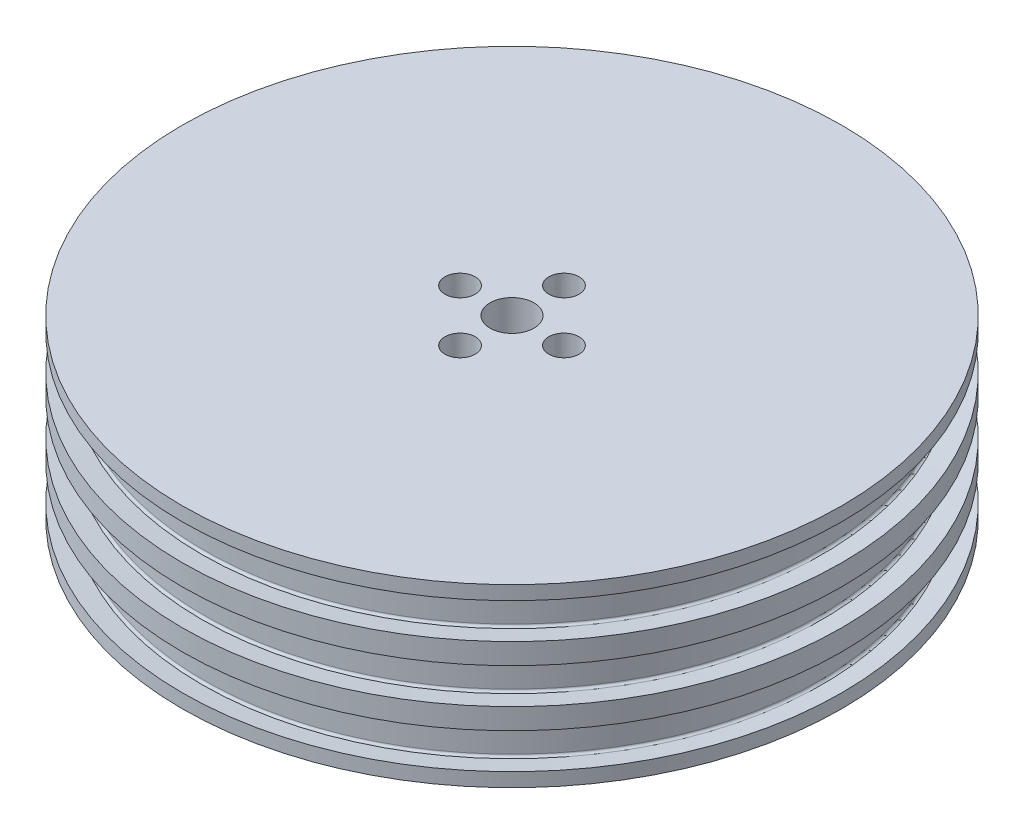
ISO-10303-21;
HEADER;
FILE_DESCRIPTION(('STEP AP214'),'2;1');
FILE_NAME('part.step','',(''),(''),'','','');
FILE_SCHEMA(('AUTOMOTIVE_DESIGN { 1 0 10303 214 1 1 1 1 }'));
ENDSEC;
DATA;
#1=APPLICATION_CONTEXT('core data for automotive mechanical design processes');
#2=APPLICATION_PROTOCOL_DEFINITION('international standard','automotive_design',2000,#1);
#3=PRODUCT_CONTEXT('',#1,'mechanical');
#4=PRODUCT('Part','Part','',(#3));
#5=PRODUCT_RELATED_PRODUCT_CATEGORY('part','',(#4));
#6=PRODUCT_DEFINITION_FORMATION('','',#4);
#7=PRODUCT_DEFINITION_CONTEXT('part definition',#1,'design');
#8=PRODUCT_DEFINITION('design','',#6,#7);
#9=PRODUCT_DEFINITION_SHAPE('','',#8);
#10=(LENGTH_UNIT() NAMED_UNIT(*) SI_UNIT(.MILLI.,.METRE.));
#11=(NAMED_UNIT(*) PLANE_ANGLE_UNIT() SI_UNIT($,.RADIAN.));
#12=(NAMED_UNIT(*) SI_UNIT($,.STERADIAN.) SOLID_ANGLE_UNIT());
#13=UNCERTAINTY_MEASURE_WITH_UNIT(LENGTH_MEASURE(1.E-05),#10,'distance_accuracy_value','');
#14=(GEOMETRIC_REPRESENTATION_CONTEXT(3) GLOBAL_UNCERTAINTY_ASSIGNED_CONTEXT((#13)) GLOBAL_UNIT_ASSIGNED_CONTEXT((#10,
#11,#12)) REPRESENTATION_CONTEXT('',''));
#15=CARTESIAN_POINT('',(0.,0.,0.));
#16=DIRECTION('',(0.,0.,1.));
#17=DIRECTION('',(1.,0.,0.));
#18=AXIS2_PLACEMENT_3D('',#15,#16,#17);
#19=CARTESIAN_POINT('',(0.,20.32,0.));
#20=DIRECTION('',(0.,-1.,0.));
#21=DIRECTION('',(0.,0.,-1.));
#22=AXIS2_PLACEMENT_3D('',#19,#20,#21);
#23=CYLINDRICAL_SURFACE('',#22,2.54);
#24=CARTESIAN_POINT('',(0.,20.32,0.));
#25=DIRECTION('',(0.,-1.,0.));
#26=DIRECTION('',(0.,0.,-1.));
#27=AXIS2_PLACEMENT_3D('',#24,#25,#26);
#28=CIRCLE('',#27,2.54);
#29=CARTESIAN_POINT('',(0.,20.32,-2.54));
#30=VERTEX_POINT('',#29);
#31=EDGE_CURVE('E132',#30,#30,#28,.T.);
#32=ORIENTED_EDGE('',*,*,#31,.F.);
#33=EDGE_LOOP('',(#32));
#34=FACE_BOUND('',#33,.T.);
#35=CARTESIAN_POINT('',(0.,15.24,0.));
#36=DIRECTION('',(0.,-1.,0.));
#37=DIRECTION('',(0.,0.,-1.));
#38=AXIS2_PLACEMENT_3D('',#35,#36,#37);
#39=CIRCLE('',#38,2.54);
#40=CARTESIAN_POINT('',(0.,15.24,-2.54));
#41=VERTEX_POINT('',#40);
#42=EDGE_CURVE('E111',#41,#41,#39,.F.);
#43=ORIENTED_EDGE('',*,*,#42,.F.);
#44=EDGE_LOOP('',(#43));
#45=FACE_BOUND('',#44,.T.);
#46=ADVANCED_FACE('F32',(#34,#45),#23,.F.);
#47=CARTESIAN_POINT('',(-6.,22.86,0.));
#48=DIRECTION('',(0.,-1.,0.));
#49=DIRECTION('',(0.,0.,-1.));
#50=AXIS2_PLACEMENT_3D('',#47,#48,#49);
#51=CYLINDRICAL_SURFACE('',#50,1.75);
#52=CARTESIAN_POINT('',(-6.,20.32,0.));
#53=DIRECTION('',(0.,1.,0.));
#54=DIRECTION('',(0.,0.,1.));
#55=AXIS2_PLACEMENT_3D('',#52,#53,#54);
#56=CIRCLE('',#55,1.75);
#57=CARTESIAN_POINT('',(-6.,20.32,1.75));
#58=VERTEX_POINT('',#57);
#59=EDGE_CURVE('E116',#58,#58,#56,.T.);
#60=ORIENTED_EDGE('',*,*,#59,.T.);
#61=EDGE_LOOP('',(#60));
#62=FACE_BOUND('',#61,.T.);
#63=CARTESIAN_POINT('',(-6.,15.24,0.));
#64=DIRECTION('',(0.,-1.,0.));
#65=DIRECTION('',(0.,0.,-1.));
#66=AXIS2_PLACEMENT_3D('',#63,#64,#65);
#67=CIRCLE('',#66,1.75);
#68=CARTESIAN_POINT('',(-6.,15.24,-1.75));
#69=VERTEX_POINT('',#68);
#70=EDGE_CURVE('E105',#69,#69,#67,.T.);
#71=ORIENTED_EDGE('',*,*,#70,.T.);
#72=EDGE_LOOP('',(#71));
#73=FACE_BOUND('',#72,.T.);
#74=ADVANCED_FACE('F235',(#62,#73),#51,.F.);
#75=CARTESIAN_POINT('',(0.,22.86,-6.));
#76=DIRECTION('',(0.,-1.,0.));
#77=DIRECTION('',(0.,0.,-1.));
#78=AXIS2_PLACEMENT_3D('',#75,#76,#77);
#79=CYLINDRICAL_SURFACE('',#78,1.75);
#80=CARTESIAN_POINT('',(0.,20.32,-6.));
#81=DIRECTION('',(0.,1.,0.));
#82=DIRECTION('',(0.,0.,1.));
#83=AXIS2_PLACEMENT_3D('',#80,#81,#82);
#84=CIRCLE('',#83,1.75);
#85=CARTESIAN_POINT('',(0.,20.32,-4.25));
#86=VERTEX_POINT('',#85);
#87=EDGE_CURVE('E119',#86,#86,#84,.T.);
#88=ORIENTED_EDGE('',*,*,#87,.T.);
#89=EDGE_LOOP('',(#88));
#90=FACE_BOUND('',#89,.T.);
#91=CARTESIAN_POINT('',(0.,15.24,-6.));
#92=DIRECTION('',(0.,-1.,0.));
#93=DIRECTION('',(0.,0.,-1.));
#94=AXIS2_PLACEMENT_3D('',#91,#92,#93);
#95=CIRCLE('',#94,1.75);
#96=CARTESIAN_POINT('',(0.,15.24,-7.75));
#97=VERTEX_POINT('',#96);
#98=EDGE_CURVE('E301',#97,#97,#95,.T.);
#99=ORIENTED_EDGE('',*,*,#98,.T.);
#100=EDGE_LOOP('',(#99));
#101=FACE_BOUND('',#100,.T.);
#102=ADVANCED_FACE('F241',(#90,#101),#79,.F.);
#103=CARTESIAN_POINT('',(6.,22.86,0.));
#104=DIRECTION('',(0.,-1.,0.));
#105=DIRECTION('',(0.,0.,-1.));
#106=AXIS2_PLACEMENT_3D('',#103,#104,#105);
#107=CYLINDRICAL_SURFACE('',#106,1.75);
#108=CARTESIAN_POINT('',(6.,20.32,0.));
#109=DIRECTION('',(0.,1.,0.));
#110=DIRECTION('',(0.,0.,1.));
#111=AXIS2_PLACEMENT_3D('',#108,#109,#110);
#112=CIRCLE('',#111,1.75);
#113=CARTESIAN_POINT('',(6.,20.32,1.75));
#114=VERTEX_POINT('',#113);
#115=EDGE_CURVE('E122',#114,#114,#112,.T.);
#116=ORIENTED_EDGE('',*,*,#115,.T.);
#117=EDGE_LOOP('',(#116));
#118=FACE_BOUND('',#117,.T.);
#119=CARTESIAN_POINT('',(6.,15.24,0.));
#120=DIRECTION('',(0.,-1.,0.));
#121=DIRECTION('',(0.,0.,-1.));
#122=AXIS2_PLACEMENT_3D('',#119,#120,#121);
#123=CIRCLE('',#122,1.75);
#124=CARTESIAN_POINT('',(6.,15.24,-1.75));
#125=VERTEX_POINT('',#124);
#126=EDGE_CURVE('E303',#125,#125,#123,.T.);
#127=ORIENTED_EDGE('',*,*,#126,.T.);
#128=EDGE_LOOP('',(#127));
#129=FACE_BOUND('',#128,.T.);
#130=ADVANCED_FACE('F322',(#118,#129),#107,.F.);
#131=CARTESIAN_POINT('',(0.,22.86,6.));
#132=DIRECTION('',(0.,-1.,0.));
#133=DIRECTION('',(0.,0.,-1.));
#134=AXIS2_PLACEMENT_3D('',#131,#132,#133);
#135=CYLINDRICAL_SURFACE('',#134,1.75);
#136=CARTESIAN_POINT('',(0.,20.32,6.));
#137=DIRECTION('',(0.,1.,0.));
#138=DIRECTION('',(0.,0.,1.));
#139=AXIS2_PLACEMENT_3D('',#136,#137,#138);
#140=CIRCLE('',#139,1.75);
#141=CARTESIAN_POINT('',(0.,20.32,7.75));
#142=VERTEX_POINT('',#141);
#143=EDGE_CURVE('E125',#142,#142,#140,.T.);
#144=ORIENTED_EDGE('',*,*,#143,.T.);
#145=EDGE_LOOP('',(#144));
#146=FACE_BOUND('',#145,.T.);
#147=CARTESIAN_POINT('',(0.,15.24,6.));
#148=DIRECTION('',(0.,-1.,0.));
#149=DIRECTION('',(0.,0.,-1.));
#150=AXIS2_PLACEMENT_3D('',#147,#148,#149);
#151=CIRCLE('',#150,1.75);
#152=CARTESIAN_POINT('',(0.,15.24,4.25));
#153=VERTEX_POINT('',#152);
#154=EDGE_CURVE('E308',#153,#153,#151,.T.);
#155=ORIENTED_EDGE('',*,*,#154,.T.);
#156=EDGE_LOOP('',(#155));
#157=FACE_BOUND('',#156,.T.);
#158=ADVANCED_FACE('F282',(#146,#157),#135,.F.);
#159=CARTESIAN_POINT('',(0.,20.32,0.));
#160=DIRECTION('',(0.,-1.,0.));
#161=DIRECTION('',(0.,0.,-1.));
#162=AXIS2_PLACEMENT_3D('',#159,#160,#161);
#163=CYLINDRICAL_SURFACE('',#162,38.1);
#164=CARTESIAN_POINT('',(0.,20.32,0.));
#165=DIRECTION('',(0.,1.,0.));
#166=DIRECTION('',(0.,0.,1.));
#167=AXIS2_PLACEMENT_3D('',#164,#165,#166);
#168=CIRCLE('',#167,38.1);
#169=CARTESIAN_POINT('',(0.,20.32,38.1));
#170=VERTEX_POINT('',#169);
#171=EDGE_CURVE('E138',#170,#170,#168,.T.);
#172=ORIENTED_EDGE('',*,*,#171,.F.);
#173=EDGE_LOOP('',(#172));
#174=FACE_BOUND('',#173,.T.);
#175=CARTESIAN_POINT('',(0.,18.715602656128,0.));
#176=DIRECTION('',(0.,-1.,0.));
#177=DIRECTION('',(0.,0.,-1.));
#178=AXIS2_PLACEMENT_3D('',#175,#176,#177);
#179=CIRCLE('',#178,38.1);
#180=CARTESIAN_POINT('',(0.,18.715602656128,-38.1));
#181=VERTEX_POINT('',#180);
#182=EDGE_CURVE('E157',#181,#181,#179,.T.);
#183=ORIENTED_EDGE('',*,*,#182,.F.);
#184=EDGE_LOOP('',(#183));
#185=FACE_BOUND('',#184,.T.);
#186=ADVANCED_FACE('F230',(#174,#185),#163,.T.);
#187=CARTESIAN_POINT('',(0.,20.32,0.));
#188=DIRECTION('',(0.,1.,0.));
#189=DIRECTION('',(0.,0.,1.));
#190=AXIS2_PLACEMENT_3D('',#187,#188,#189);
#191=PLANE('',#190);
#192=ORIENTED_EDGE('',*,*,#143,.F.);
#193=EDGE_LOOP('',(#192));
#194=FACE_BOUND('',#193,.T.);
#195=ORIENTED_EDGE('',*,*,#115,.F.);
#196=EDGE_LOOP('',(#195));
#197=FACE_BOUND('',#196,.T.);
#198=ORIENTED_EDGE('',*,*,#87,.F.);
#199=EDGE_LOOP('',(#198));
#200=FACE_BOUND('',#199,.T.);
#201=ORIENTED_EDGE('',*,*,#59,.F.);
#202=EDGE_LOOP('',(#201));
#203=FACE_BOUND('',#202,.T.);
#204=ORIENTED_EDGE('',*,*,#31,.T.);
#205=EDGE_LOOP('',(#204));
#206=FACE_BOUND('',#205,.T.);
#207=ORIENTED_EDGE('',*,*,#171,.T.);
#208=EDGE_LOOP('',(#207));
#209=FACE_BOUND('',#208,.T.);
#210=ADVANCED_FACE('F260',(#194,#197,#200,#203,#206,#209),#191,.T.);
#211=CARTESIAN_POINT('',(0.,14.9562946877439,0.));
#212=DIRECTION('',(0.,1.,0.));
#213=DIRECTION('',(0.,0.,1.));
#214=AXIS2_PLACEMENT_3D('',#211,#212,#213);
#215=CONICAL_SURFACE('',#214,40.64,1.43989663289533);
#216=CARTESIAN_POINT('',(0.,14.3253044955856,0.));
#217=DIRECTION('',(0.,1.,0.));
#218=DIRECTION('',(0.,0.,1.));
#219=AXIS2_PLACEMENT_3D('',#216,#217,#218);
#220=CIRCLE('',#219,35.8471536528239);
#221=CARTESIAN_POINT('',(0.,14.3253044955856,35.8471536528239));
#222=VERTEX_POINT('',#221);
#223=EDGE_CURVE('E170',#222,#222,#220,.F.);
#224=ORIENTED_EDGE('',*,*,#223,.T.);
#225=EDGE_LOOP('',(#224));
#226=FACE_BOUND('',#225,.T.);
#227=CARTESIAN_POINT('',(0.,14.621897343872,0.));
#228=DIRECTION('',(0.,1.,0.));
#229=DIRECTION('',(0.,0.,1.));
#230=AXIS2_PLACEMENT_3D('',#227,#228,#229);
#231=CIRCLE('',#230,38.1);
#232=CARTESIAN_POINT('',(0.,14.621897343872,38.1));
#233=VERTEX_POINT('',#232);
#234=EDGE_CURVE('E145',#233,#233,#231,.T.);
#235=ORIENTED_EDGE('',*,*,#234,.T.);
#236=EDGE_LOOP('',(#235));
#237=FACE_BOUND('',#236,.T.);
#238=ADVANCED_FACE('F253',(#226,#237),#215,.F.);
#239=CARTESIAN_POINT('',(0.,19.05,0.));
#240=DIRECTION('',(0.,-1.,0.));
#241=DIRECTION('',(0.,0.,-1.));
#242=AXIS2_PLACEMENT_3D('',#239,#240,#241);
#243=CONICAL_SURFACE('',#242,35.56,1.43989663289533);
#244=CARTESIAN_POINT('',(0.,19.0121955044144,0.));
#245=DIRECTION('',(0.,-1.,0.));
#246=DIRECTION('',(0.,0.,-1.));
#247=AXIS2_PLACEMENT_3D('',#244,#245,#246);
#248=CIRCLE('',#247,35.8471536528239);
#249=CARTESIAN_POINT('',(0.,19.0121955044144,-35.8471536528239));
#250=VERTEX_POINT('',#249);
#251=EDGE_CURVE('E167',#250,#250,#248,.F.);
#252=ORIENTED_EDGE('',*,*,#251,.T.);
#253=EDGE_LOOP('',(#252));
#254=FACE_BOUND('',#253,.T.);
#255=ORIENTED_EDGE('',*,*,#182,.T.);
#256=EDGE_LOOP('',(#255));
#257=FACE_BOUND('',#256,.T.);
#258=ADVANCED_FACE('F250',(#254,#257),#243,.F.);
#259=CARTESIAN_POINT('',(0.,0.,0.));
#260=DIRECTION('',(0.,-1.,0.));
#261=DIRECTION('',(0.,0.,-1.));
#262=AXIS2_PLACEMENT_3D('',#259,#260,#261);
#263=CYLINDRICAL_SURFACE('',#262,35.56);
#264=CARTESIAN_POINT('',(0.,18.7603685096254,0.));
#265=DIRECTION('',(0.,-1.,0.));
#266=DIRECTION('',(0.,0.,-1.));
#267=AXIS2_PLACEMENT_3D('',#264,#265,#266);
#268=CIRCLE('',#267,35.56);
#269=CARTESIAN_POINT('',(0.,18.7603685096254,-35.56));
#270=VERTEX_POINT('',#269);
#271=EDGE_CURVE('E164',#270,#270,#268,.T.);
#272=ORIENTED_EDGE('',*,*,#271,.T.);
#273=EDGE_LOOP('',(#272));
#274=FACE_BOUND('',#273,.T.);
#275=CARTESIAN_POINT('',(0.,14.5771314903746,0.));
#276=DIRECTION('',(0.,-1.,0.));
#277=DIRECTION('',(0.,0.,-1.));
#278=AXIS2_PLACEMENT_3D('',#275,#276,#277);
#279=CIRCLE('',#278,35.56);
#280=CARTESIAN_POINT('',(0.,14.5771314903746,-35.56));
#281=VERTEX_POINT('',#280);
#282=EDGE_CURVE('E141',#281,#281,#279,.F.);
#283=ORIENTED_EDGE('',*,*,#282,.T.);
#284=EDGE_LOOP('',(#283));
#285=FACE_BOUND('',#284,.T.);
#286=ADVANCED_FACE('F228',(#274,#285),#263,.T.);
#287=CARTESIAN_POINT('',(0.,12.206852656128,0.));
#288=DIRECTION('',(0.,-1.,0.));
#289=DIRECTION('',(0.,0.,-1.));
#290=AXIS2_PLACEMENT_3D('',#287,#288,#289);
#291=CIRCLE('',#290,38.1);
#292=CARTESIAN_POINT('',(0.,12.206852656128,-38.1));
#293=VERTEX_POINT('',#292);
#294=EDGE_CURVE('E151',#293,#293,#291,.T.);
#295=ORIENTED_EDGE('',*,*,#294,.F.);
#296=EDGE_LOOP('',(#295));
#297=FACE_BOUND('',#296,.T.);
#298=ORIENTED_EDGE('',*,*,#234,.F.);
#299=EDGE_LOOP('',(#298));
#300=FACE_BOUND('',#299,.T.);
#301=ADVANCED_FACE('F216',(#297,#300),#163,.T.);
#302=CARTESIAN_POINT('',(0.,8.44754468774393,0.));
#303=DIRECTION('',(0.,1.,0.));
#304=DIRECTION('',(0.,0.,1.));
#305=AXIS2_PLACEMENT_3D('',#302,#303,#304);
#306=CONICAL_SURFACE('',#305,40.6399999999999,1.43989663289533);
#307=CARTESIAN_POINT('',(0.,7.81655449558555,0.));
#308=DIRECTION('',(0.,1.,0.));
#309=DIRECTION('',(0.,0.,1.));
#310=AXIS2_PLACEMENT_3D('',#307,#308,#309);
#311=CIRCLE('',#310,35.8471536528238);
#312=CARTESIAN_POINT('',(0.,7.81655449558555,35.8471536528238));
#313=VERTEX_POINT('',#312);
#314=EDGE_CURVE('E182',#313,#313,#311,.F.);
#315=ORIENTED_EDGE('',*,*,#314,.T.);
#316=EDGE_LOOP('',(#315));
#317=FACE_BOUND('',#316,.T.);
#318=CARTESIAN_POINT('',(0.,8.11314734387198,0.));
#319=DIRECTION('',(0.,1.,0.));
#320=DIRECTION('',(0.,0.,1.));
#321=AXIS2_PLACEMENT_3D('',#318,#319,#320);
#322=CIRCLE('',#321,38.1);
#323=CARTESIAN_POINT('',(0.,8.11314734387198,38.1));
#324=VERTEX_POINT('',#323);
#325=EDGE_CURVE('E154',#324,#324,#322,.T.);
#326=ORIENTED_EDGE('',*,*,#325,.T.);
#327=EDGE_LOOP('',(#326));
#328=FACE_BOUND('',#327,.T.);
#329=ADVANCED_FACE('F227',(#317,#328),#306,.F.);
#330=CARTESIAN_POINT('',(0.,12.54125,0.));
#331=DIRECTION('',(0.,-1.,0.));
#332=DIRECTION('',(0.,0.,-1.));
#333=AXIS2_PLACEMENT_3D('',#330,#331,#332);
#334=CONICAL_SURFACE('',#333,35.5599999999999,1.43989663289533);
#335=CARTESIAN_POINT('',(0.,12.5034455044144,0.));
#336=DIRECTION('',(0.,-1.,0.));
#337=DIRECTION('',(0.,0.,-1.));
#338=AXIS2_PLACEMENT_3D('',#335,#336,#337);
#339=CIRCLE('',#338,35.8471536528238);
#340=CARTESIAN_POINT('',(0.,12.5034455044144,-35.8471536528238));
#341=VERTEX_POINT('',#340);
#342=EDGE_CURVE('E179',#341,#341,#339,.F.);
#343=ORIENTED_EDGE('',*,*,#342,.T.);
#344=EDGE_LOOP('',(#343));
#345=FACE_BOUND('',#344,.T.);
#346=ORIENTED_EDGE('',*,*,#294,.T.);
#347=EDGE_LOOP('',(#346));
#348=FACE_BOUND('',#347,.T.);
#349=ADVANCED_FACE('F262',(#345,#348),#334,.F.);
#350=CARTESIAN_POINT('',(0.,0.,0.));
#351=DIRECTION('',(0.,-1.,0.));
#352=DIRECTION('',(0.,0.,-1.));
#353=AXIS2_PLACEMENT_3D('',#350,#351,#352);
#354=CYLINDRICAL_SURFACE('',#353,35.5599999999999);
#355=CARTESIAN_POINT('',(0.,12.2516185096254,0.));
#356=DIRECTION('',(0.,-1.,0.));
#357=DIRECTION('',(0.,0.,-1.));
#358=AXIS2_PLACEMENT_3D('',#355,#356,#357);
#359=CIRCLE('',#358,35.5599999999999);
#360=CARTESIAN_POINT('',(0.,12.2516185096254,-35.5599999999999));
#361=VERTEX_POINT('',#360);
#362=EDGE_CURVE('E176',#361,#361,#359,.T.);
#363=ORIENTED_EDGE('',*,*,#362,.T.);
#364=EDGE_LOOP('',(#363));
#365=FACE_BOUND('',#364,.T.);
#366=CARTESIAN_POINT('',(0.,8.06838149037455,0.));
#367=DIRECTION('',(0.,-1.,0.));
#368=DIRECTION('',(0.,0.,-1.));
#369=AXIS2_PLACEMENT_3D('',#366,#367,#368);
#370=CIRCLE('',#369,35.5599999999999);
#371=CARTESIAN_POINT('',(0.,8.06838149037455,-35.5599999999999));
#372=VERTEX_POINT('',#371);
#373=EDGE_CURVE('E173',#372,#372,#370,.F.);
#374=ORIENTED_EDGE('',*,*,#373,.T.);
#375=EDGE_LOOP('',(#374));
#376=FACE_BOUND('',#375,.T.);
#377=ADVANCED_FACE('F232',(#365,#376),#354,.T.);
#378=CARTESIAN_POINT('',(0.,5.69810265612802,0.));
#379=DIRECTION('',(0.,-1.,0.));
#380=DIRECTION('',(0.,0.,-1.));
#381=AXIS2_PLACEMENT_3D('',#378,#379,#380);
#382=CIRCLE('',#381,38.1);
#383=CARTESIAN_POINT('',(0.,5.69810265612802,-38.1));
#384=VERTEX_POINT('',#383);
#385=EDGE_CURVE('E137',#384,#384,#382,.T.);
#386=ORIENTED_EDGE('',*,*,#385,.F.);
#387=EDGE_LOOP('',(#386));
#388=FACE_BOUND('',#387,.T.);
#389=ORIENTED_EDGE('',*,*,#325,.F.);
#390=EDGE_LOOP('',(#389));
#391=FACE_BOUND('',#390,.T.);
#392=ADVANCED_FACE('F206',(#388,#391),#163,.T.);
#393=CARTESIAN_POINT('',(0.,1.93879468774394,0.));
#394=DIRECTION('',(0.,1.,0.));
#395=DIRECTION('',(0.,0.,1.));
#396=AXIS2_PLACEMENT_3D('',#393,#394,#395);
#397=CONICAL_SURFACE('',#396,40.6399999999999,1.43989663289533);
#398=CARTESIAN_POINT('',(0.,1.3078044955856,0.));
#399=DIRECTION('',(0.,1.,0.));
#400=DIRECTION('',(0.,0.,1.));
#401=AXIS2_PLACEMENT_3D('',#398,#399,#400);
#402=CIRCLE('',#401,35.8471536528238);
#403=CARTESIAN_POINT('',(0.,1.3078044955856,35.8471536528238));
#404=VERTEX_POINT('',#403);
#405=EDGE_CURVE('E185',#404,#404,#402,.F.);
#406=ORIENTED_EDGE('',*,*,#405,.T.);
#407=EDGE_LOOP('',(#406));
#408=FACE_BOUND('',#407,.T.);
#409=CARTESIAN_POINT('',(0.,1.60439734387199,0.));
#410=DIRECTION('',(0.,1.,0.));
#411=DIRECTION('',(0.,0.,1.));
#412=AXIS2_PLACEMENT_3D('',#409,#410,#411);
#413=CIRCLE('',#412,38.1);
#414=CARTESIAN_POINT('',(0.,1.60439734387199,38.1));
#415=VERTEX_POINT('',#414);
#416=EDGE_CURVE('E148',#415,#415,#413,.T.);
#417=ORIENTED_EDGE('',*,*,#416,.T.);
#418=EDGE_LOOP('',(#417));
#419=FACE_BOUND('',#418,.T.);
#420=ADVANCED_FACE('F202',(#408,#419),#397,.F.);
#421=CARTESIAN_POINT('',(0.,6.0325,0.));
#422=DIRECTION('',(0.,-1.,0.));
#423=DIRECTION('',(0.,0.,-1.));
#424=AXIS2_PLACEMENT_3D('',#421,#422,#423);
#425=CONICAL_SURFACE('',#424,35.5599999999999,1.43989663289533);
#426=CARTESIAN_POINT('',(0.,5.99469550441439,0.));
#427=DIRECTION('',(0.,-1.,0.));
#428=DIRECTION('',(0.,0.,-1.));
#429=AXIS2_PLACEMENT_3D('',#426,#427,#428);
#430=CIRCLE('',#429,35.8471536528237);
#431=CARTESIAN_POINT('',(0.,5.99469550441439,-35.8471536528237));
#432=VERTEX_POINT('',#431);
#433=EDGE_CURVE('E11',#432,#432,#430,.F.);
#434=ORIENTED_EDGE('',*,*,#433,.T.);
#435=EDGE_LOOP('',(#434));
#436=FACE_BOUND('',#435,.T.);
#437=ORIENTED_EDGE('',*,*,#385,.T.);
#438=EDGE_LOOP('',(#437));
#439=FACE_BOUND('',#438,.T.);
#440=ADVANCED_FACE('F205',(#436,#439),#425,.F.);
#441=CARTESIAN_POINT('',(0.,0.,0.));
#442=DIRECTION('',(0.,-1.,0.));
#443=DIRECTION('',(0.,0.,-1.));
#444=AXIS2_PLACEMENT_3D('',#441,#442,#443);
#445=CYLINDRICAL_SURFACE('',#444,35.5599999999999);
#446=CARTESIAN_POINT('',(0.,1.55963149037456,0.));
#447=DIRECTION('',(0.,-1.,0.));
#448=DIRECTION('',(0.,0.,-1.));
#449=AXIS2_PLACEMENT_3D('',#446,#447,#448);
#450=CIRCLE('',#449,35.5599999999999);
#451=CARTESIAN_POINT('',(0.,1.55963149037456,-35.5599999999999));
#452=VERTEX_POINT('',#451);
#453=EDGE_CURVE('E40',#452,#452,#450,.F.);
#454=ORIENTED_EDGE('',*,*,#453,.T.);
#455=EDGE_LOOP('',(#454));
#456=FACE_BOUND('',#455,.T.);
#457=CARTESIAN_POINT('',(0.,5.74286850962545,0.));
#458=DIRECTION('',(0.,-1.,0.));
#459=DIRECTION('',(0.,0.,-1.));
#460=AXIS2_PLACEMENT_3D('',#457,#458,#459);
#461=CIRCLE('',#460,35.5599999999999);
#462=CARTESIAN_POINT('',(0.,5.74286850962545,-35.5599999999999));
#463=VERTEX_POINT('',#462);
#464=EDGE_CURVE('E188',#463,#463,#461,.T.);
#465=ORIENTED_EDGE('',*,*,#464,.T.);
#466=EDGE_LOOP('',(#465));
#467=FACE_BOUND('',#466,.T.);
#468=ADVANCED_FACE('F193',(#456,#467),#445,.T.);
#469=CARTESIAN_POINT('',(0.,0.,0.));
#470=DIRECTION('',(0.,1.,0.));
#471=DIRECTION('',(0.,0.,1.));
#472=AXIS2_PLACEMENT_3D('',#469,#470,#471);
#473=PLANE('',#472);
#474=CARTESIAN_POINT('',(0.,0.,0.));
#475=DIRECTION('',(0.,-1.,0.));
#476=DIRECTION('',(0.,0.,-1.));
#477=AXIS2_PLACEMENT_3D('',#474,#475,#476);
#478=CIRCLE('',#477,12.7);
#479=CARTESIAN_POINT('',(0.,0.,-12.7));
#480=VERTEX_POINT('',#479);
#481=EDGE_CURVE('E128',#480,#480,#478,.T.);
#482=ORIENTED_EDGE('',*,*,#481,.F.);
#483=EDGE_LOOP('',(#482));
#484=FACE_BOUND('',#483,.T.);
#485=CARTESIAN_POINT('',(0.,0.,0.));
#486=DIRECTION('',(0.,1.,0.));
#487=DIRECTION('',(0.,0.,1.));
#488=AXIS2_PLACEMENT_3D('',#485,#486,#487);
#489=CIRCLE('',#488,38.1);
#490=CARTESIAN_POINT('',(0.,0.,38.1));
#491=VERTEX_POINT('',#490);
#492=EDGE_CURVE('E142',#491,#491,#489,.T.);
#493=ORIENTED_EDGE('',*,*,#492,.F.);
#494=EDGE_LOOP('',(#493));
#495=FACE_BOUND('',#494,.T.);
#496=ADVANCED_FACE('F213',(#484,#495),#473,.F.);
#497=ORIENTED_EDGE('',*,*,#492,.T.);
#498=EDGE_LOOP('',(#497));
#499=FACE_BOUND('',#498,.T.);
#500=ORIENTED_EDGE('',*,*,#416,.F.);
#501=EDGE_LOOP('',(#500));
#502=FACE_BOUND('',#501,.T.);
#503=ADVANCED_FACE('F210',(#499,#502),#163,.T.);
#504=CARTESIAN_POINT('',(0.,18.7603685096254,0.));
#505=DIRECTION('',(0.,-1.,0.));
#506=DIRECTION('',(0.,0.,-1.));
#507=AXIS2_PLACEMENT_3D('',#504,#505,#506);
#508=TOROIDAL_SURFACE('',#507,35.814,0.254);
#509=ORIENTED_EDGE('',*,*,#251,.F.);
#510=EDGE_LOOP('',(#509));
#511=FACE_BOUND('',#510,.T.);
#512=ORIENTED_EDGE('',*,*,#271,.F.);
#513=EDGE_LOOP('',(#512));
#514=FACE_BOUND('',#513,.T.);
#515=ADVANCED_FACE('F212',(#511,#514),#508,.F.);
#516=CARTESIAN_POINT('',(0.,14.5771314903746,0.));
#517=DIRECTION('',(0.,-1.,0.));
#518=DIRECTION('',(0.,0.,-1.));
#519=AXIS2_PLACEMENT_3D('',#516,#517,#518);
#520=TOROIDAL_SURFACE('',#519,35.814,0.254);
#521=ORIENTED_EDGE('',*,*,#282,.F.);
#522=EDGE_LOOP('',(#521));
#523=FACE_BOUND('',#522,.T.);
#524=ORIENTED_EDGE('',*,*,#223,.F.);
#525=EDGE_LOOP('',(#524));
#526=FACE_BOUND('',#525,.T.);
#527=ADVANCED_FACE('F221',(#523,#526),#520,.F.);
#528=CARTESIAN_POINT('',(0.,12.2516185096254,0.));
#529=DIRECTION('',(0.,-1.,0.));
#530=DIRECTION('',(0.,0.,-1.));
#531=AXIS2_PLACEMENT_3D('',#528,#529,#530);
#532=TOROIDAL_SURFACE('',#531,35.8139999999999,0.254);
#533=ORIENTED_EDGE('',*,*,#342,.F.);
#534=EDGE_LOOP('',(#533));
#535=FACE_BOUND('',#534,.T.);
#536=ORIENTED_EDGE('',*,*,#362,.F.);
#537=EDGE_LOOP('',(#536));
#538=FACE_BOUND('',#537,.T.);
#539=ADVANCED_FACE('F454',(#535,#538),#532,.F.);
#540=CARTESIAN_POINT('',(0.,8.06838149037455,0.));
#541=DIRECTION('',(0.,-1.,0.));
#542=DIRECTION('',(0.,0.,-1.));
#543=AXIS2_PLACEMENT_3D('',#540,#541,#542);
#544=TOROIDAL_SURFACE('',#543,35.8139999999999,0.254);
#545=ORIENTED_EDGE('',*,*,#373,.F.);
#546=EDGE_LOOP('',(#545));
#547=FACE_BOUND('',#546,.T.);
#548=ORIENTED_EDGE('',*,*,#314,.F.);
#549=EDGE_LOOP('',(#548));
#550=FACE_BOUND('',#549,.T.);
#551=ADVANCED_FACE('F199',(#547,#550),#544,.F.);
#552=CARTESIAN_POINT('',(0.,1.55963149037456,0.));
#553=DIRECTION('',(0.,-1.,0.));
#554=DIRECTION('',(0.,0.,-1.));
#555=AXIS2_PLACEMENT_3D('',#552,#553,#554);
#556=TOROIDAL_SURFACE('',#555,35.8139999999999,0.254);
#557=ORIENTED_EDGE('',*,*,#453,.F.);
#558=EDGE_LOOP('',(#557));
#559=FACE_BOUND('',#558,.T.);
#560=ORIENTED_EDGE('',*,*,#405,.F.);
#561=EDGE_LOOP('',(#560));
#562=FACE_BOUND('',#561,.T.);
#563=ADVANCED_FACE('F196',(#559,#562),#556,.F.);
#564=CARTESIAN_POINT('',(0.,5.74286850962545,0.));
#565=DIRECTION('',(0.,-1.,0.));
#566=DIRECTION('',(0.,0.,-1.));
#567=AXIS2_PLACEMENT_3D('',#564,#565,#566);
#568=TOROIDAL_SURFACE('',#567,35.8139999999999,0.254);
#569=ORIENTED_EDGE('',*,*,#433,.F.);
#570=EDGE_LOOP('',(#569));
#571=FACE_BOUND('',#570,.T.);
#572=ORIENTED_EDGE('',*,*,#464,.F.);
#573=EDGE_LOOP('',(#572));
#574=FACE_BOUND('',#573,.T.);
#575=ADVANCED_FACE('F34',(#571,#574),#568,.F.);
#576=CARTESIAN_POINT('',(0.,10.16,0.));
#577=DIRECTION('',(0.,-1.,0.));
#578=DIRECTION('',(0.,0.,-1.));
#579=AXIS2_PLACEMENT_3D('',#576,#577,#578);
#580=PLANE('',#579);
#581=CARTESIAN_POINT('',(0.,10.16,-6.));
#582=DIRECTION('',(0.,-1.,0.));
#583=DIRECTION('',(0.,0.,-1.));
#584=AXIS2_PLACEMENT_3D('',#581,#582,#583);
#585=CIRCLE('',#584,4.29);
#586=CARTESIAN_POINT('',(-3.44949972191315,10.16,-3.44949972191315));
#587=VERTEX_POINT('',#586);
#588=CARTESIAN_POINT('',(3.44949972191315,10.16,-3.44949972191315));
#589=VERTEX_POINT('',#588);
#590=EDGE_CURVE('E47',#587,#589,#585,.T.);
#591=ORIENTED_EDGE('',*,*,#590,.F.);
#592=CARTESIAN_POINT('',(-6.,10.16,0.));
#593=DIRECTION('',(0.,-1.,0.));
#594=DIRECTION('',(0.,0.,-1.));
#595=AXIS2_PLACEMENT_3D('',#592,#593,#594);
#596=CIRCLE('',#595,4.29);
#597=CARTESIAN_POINT('',(-3.44949972191315,10.16,3.44949972191315));
#598=VERTEX_POINT('',#597);
#599=EDGE_CURVE('E99',#598,#587,#596,.T.);
#600=ORIENTED_EDGE('',*,*,#599,.F.);
#601=CARTESIAN_POINT('',(0.,10.16,6.));
#602=DIRECTION('',(0.,-1.,0.));
#603=DIRECTION('',(0.,0.,-1.));
#604=AXIS2_PLACEMENT_3D('',#601,#602,#603);
#605=CIRCLE('',#604,4.29);
#606=CARTESIAN_POINT('',(3.44949972191315,10.16,3.44949972191315));
#607=VERTEX_POINT('',#606);
#608=EDGE_CURVE('E107',#607,#598,#605,.T.);
#609=ORIENTED_EDGE('',*,*,#608,.F.);
#610=CARTESIAN_POINT('',(6.,10.16,0.));
#611=DIRECTION('',(0.,-1.,0.));
#612=DIRECTION('',(0.,0.,-1.));
#613=AXIS2_PLACEMENT_3D('',#610,#611,#612);
#614=CIRCLE('',#613,4.29);
#615=EDGE_CURVE('E82',#589,#607,#614,.T.);
#616=ORIENTED_EDGE('',*,*,#615,.F.);
#617=EDGE_LOOP('',(#591,#600,#609,#616));
#618=FACE_BOUND('',#617,.T.);
#619=CARTESIAN_POINT('',(0.,10.16,0.));
#620=DIRECTION('',(0.,-1.,0.));
#621=DIRECTION('',(0.,0.,-1.));
#622=AXIS2_PLACEMENT_3D('',#619,#620,#621);
#623=CIRCLE('',#622,12.7);
#624=CARTESIAN_POINT('',(0.,10.16,-12.7));
#625=VERTEX_POINT('',#624);
#626=EDGE_CURVE('E129',#625,#625,#623,.T.);
#627=ORIENTED_EDGE('',*,*,#626,.T.);
#628=EDGE_LOOP('',(#627));
#629=FACE_BOUND('',#628,.T.);
#630=ADVANCED_FACE('F331',(#618,#629),#580,.T.);
#631=CARTESIAN_POINT('',(0.,10.16,0.));
#632=DIRECTION('',(0.,-1.,0.));
#633=DIRECTION('',(0.,0.,-1.));
#634=AXIS2_PLACEMENT_3D('',#631,#632,#633);
#635=CYLINDRICAL_SURFACE('',#634,12.7);
#636=ORIENTED_EDGE('',*,*,#626,.F.);
#637=EDGE_LOOP('',(#636));
#638=FACE_BOUND('',#637,.T.);
#639=ORIENTED_EDGE('',*,*,#481,.T.);
#640=EDGE_LOOP('',(#639));
#641=FACE_BOUND('',#640,.T.);
#642=ADVANCED_FACE('F248',(#638,#641),#635,.F.);
#643=CARTESIAN_POINT('',(3.,15.24,-3.));
#644=DIRECTION('',(0.,-1.,0.));
#645=DIRECTION('',(0.,0.,-1.));
#646=AXIS2_PLACEMENT_3D('',#643,#644,#645);
#647=PLANE('',#646);
#648=ORIENTED_EDGE('',*,*,#154,.F.);
#649=EDGE_LOOP('',(#648));
#650=FACE_BOUND('',#649,.T.);
#651=ORIENTED_EDGE('',*,*,#126,.F.);
#652=EDGE_LOOP('',(#651));
#653=FACE_BOUND('',#652,.T.);
#654=ORIENTED_EDGE('',*,*,#98,.F.);
#655=EDGE_LOOP('',(#654));
#656=FACE_BOUND('',#655,.T.);
#657=ORIENTED_EDGE('',*,*,#70,.F.);
#658=EDGE_LOOP('',(#657));
#659=FACE_BOUND('',#658,.T.);
#660=CARTESIAN_POINT('',(0.,15.24,-6.));
#661=DIRECTION('',(0.,-1.,0.));
#662=DIRECTION('',(0.,0.,-1.));
#663=AXIS2_PLACEMENT_3D('',#660,#661,#662);
#664=CIRCLE('',#663,4.29);
#665=CARTESIAN_POINT('',(-3.44949972191315,15.24,-3.44949972191315));
#666=VERTEX_POINT('',#665);
#667=CARTESIAN_POINT('',(3.44949972191315,15.24,-3.44949972191315));
#668=VERTEX_POINT('',#667);
#669=EDGE_CURVE('E97',#666,#668,#664,.T.);
#670=ORIENTED_EDGE('',*,*,#669,.T.);
#671=CARTESIAN_POINT('',(6.,15.24,0.));
#672=DIRECTION('',(0.,-1.,0.));
#673=DIRECTION('',(0.,0.,-1.));
#674=AXIS2_PLACEMENT_3D('',#671,#672,#673);
#675=CIRCLE('',#674,4.29);
#676=CARTESIAN_POINT('',(3.44949972191315,15.24,3.44949972191315));
#677=VERTEX_POINT('',#676);
#678=EDGE_CURVE('E79',#668,#677,#675,.T.);
#679=ORIENTED_EDGE('',*,*,#678,.T.);
#680=CARTESIAN_POINT('',(0.,15.24,6.));
#681=DIRECTION('',(0.,-1.,0.));
#682=DIRECTION('',(0.,0.,-1.));
#683=AXIS2_PLACEMENT_3D('',#680,#681,#682);
#684=CIRCLE('',#683,4.29);
#685=CARTESIAN_POINT('',(-3.44949972191315,15.24,3.44949972191315));
#686=VERTEX_POINT('',#685);
#687=EDGE_CURVE('E89',#677,#686,#684,.T.);
#688=ORIENTED_EDGE('',*,*,#687,.T.);
#689=CARTESIAN_POINT('',(-6.,15.24,0.));
#690=DIRECTION('',(0.,-1.,0.));
#691=DIRECTION('',(0.,0.,-1.));
#692=AXIS2_PLACEMENT_3D('',#689,#690,#691);
#693=CIRCLE('',#692,4.29);
#694=EDGE_CURVE('E93',#686,#666,#693,.T.);
#695=ORIENTED_EDGE('',*,*,#694,.T.);
#696=EDGE_LOOP('',(#670,#679,#688,#695));
#697=FACE_BOUND('',#696,.T.);
#698=ORIENTED_EDGE('',*,*,#42,.T.);
#699=EDGE_LOOP('',(#698));
#700=FACE_BOUND('',#699,.T.);
#701=ADVANCED_FACE('F95',(#650,#653,#656,#659,#697,#700),#647,.T.);
#702=CARTESIAN_POINT('',(0.,15.24,-6.));
#703=DIRECTION('',(0.,-1.,0.));
#704=DIRECTION('',(0.,0.,-1.));
#705=AXIS2_PLACEMENT_3D('',#702,#703,#704);
#706=CYLINDRICAL_SURFACE('',#705,4.29);
#707=ORIENTED_EDGE('',*,*,#590,.T.);
#708=DIRECTION('',(0.,-1.,0.));
#709=VECTOR('',#708,1.);
#710=CARTESIAN_POINT('',(3.44949972191315,15.24,-3.44949972191315));
#711=LINE('',#710,#709);
#712=EDGE_CURVE('E70',#668,#589,#711,.T.);
#713=ORIENTED_EDGE('',*,*,#712,.F.);
#714=ORIENTED_EDGE('',*,*,#669,.F.);
#715=DIRECTION('',(0.,-1.,0.));
#716=VECTOR('',#715,1.);
#717=CARTESIAN_POINT('',(-3.44949972191315,15.24,-3.44949972191315));
#718=LINE('',#717,#716);
#719=EDGE_CURVE('E55',#666,#587,#718,.T.);
#720=ORIENTED_EDGE('',*,*,#719,.T.);
#721=EDGE_LOOP('',(#707,#713,#714,#720));
#722=FACE_BOUND('',#721,.T.);
#723=ADVANCED_FACE('F315',(#722),#706,.F.);
#724=CARTESIAN_POINT('',(-6.,15.24,0.));
#725=DIRECTION('',(0.,-1.,0.));
#726=DIRECTION('',(0.,0.,-1.));
#727=AXIS2_PLACEMENT_3D('',#724,#725,#726);
#728=CYLINDRICAL_SURFACE('',#727,4.29);
#729=ORIENTED_EDGE('',*,*,#599,.T.);
#730=ORIENTED_EDGE('',*,*,#719,.F.);
#731=ORIENTED_EDGE('',*,*,#694,.F.);
#732=DIRECTION('',(0.,-1.,0.));
#733=VECTOR('',#732,1.);
#734=CARTESIAN_POINT('',(-3.44949972191315,15.24,3.44949972191315));
#735=LINE('',#734,#733);
#736=EDGE_CURVE('E86',#686,#598,#735,.T.);
#737=ORIENTED_EDGE('',*,*,#736,.T.);
#738=EDGE_LOOP('',(#729,#730,#731,#737));
#739=FACE_BOUND('',#738,.T.);
#740=ADVANCED_FACE('F347',(#739),#728,.F.);
#741=CARTESIAN_POINT('',(0.,15.24,6.));
#742=DIRECTION('',(0.,-1.,0.));
#743=DIRECTION('',(0.,0.,-1.));
#744=AXIS2_PLACEMENT_3D('',#741,#742,#743);
#745=CYLINDRICAL_SURFACE('',#744,4.29);
#746=ORIENTED_EDGE('',*,*,#608,.T.);
#747=ORIENTED_EDGE('',*,*,#736,.F.);
#748=ORIENTED_EDGE('',*,*,#687,.F.);
#749=DIRECTION('',(0.,-1.,0.));
#750=VECTOR('',#749,1.);
#751=CARTESIAN_POINT('',(3.44949972191315,15.24,3.44949972191315));
#752=LINE('',#751,#750);
#753=EDGE_CURVE('E75',#677,#607,#752,.T.);
#754=ORIENTED_EDGE('',*,*,#753,.T.);
#755=EDGE_LOOP('',(#746,#747,#748,#754));
#756=FACE_BOUND('',#755,.T.);
#757=ADVANCED_FACE('F90',(#756),#745,.F.);
#758=CARTESIAN_POINT('',(6.,15.24,0.));
#759=DIRECTION('',(0.,-1.,0.));
#760=DIRECTION('',(0.,0.,-1.));
#761=AXIS2_PLACEMENT_3D('',#758,#759,#760);
#762=CYLINDRICAL_SURFACE('',#761,4.29);
#763=ORIENTED_EDGE('',*,*,#615,.T.);
#764=ORIENTED_EDGE('',*,*,#753,.F.);
#765=ORIENTED_EDGE('',*,*,#678,.F.);
#766=ORIENTED_EDGE('',*,*,#712,.T.);
#767=EDGE_LOOP('',(#763,#764,#765,#766));
#768=FACE_BOUND('',#767,.T.);
#769=ADVANCED_FACE('F77',(#768),#762,.F.);
#770=CLOSED_SHELL('',(#46,#74,#102,#130,#158,#186,#210,#238,#258,#286,#301,#329,#349,#377,#392,
#420,#440,#468,#496,#503,#515,#527,#539,#551,#563,#575,#630,#642,#701,#723,#740,#757,#769));
#771=MANIFOLD_SOLID_BREP('B2',#770);
#772=ADVANCED_BREP_SHAPE_REPRESENTATION('',(#18,#771),#14);
#773=SHAPE_DEFINITION_REPRESENTATION(#9,#772);
ENDSEC;
END-ISO-10303-21;
